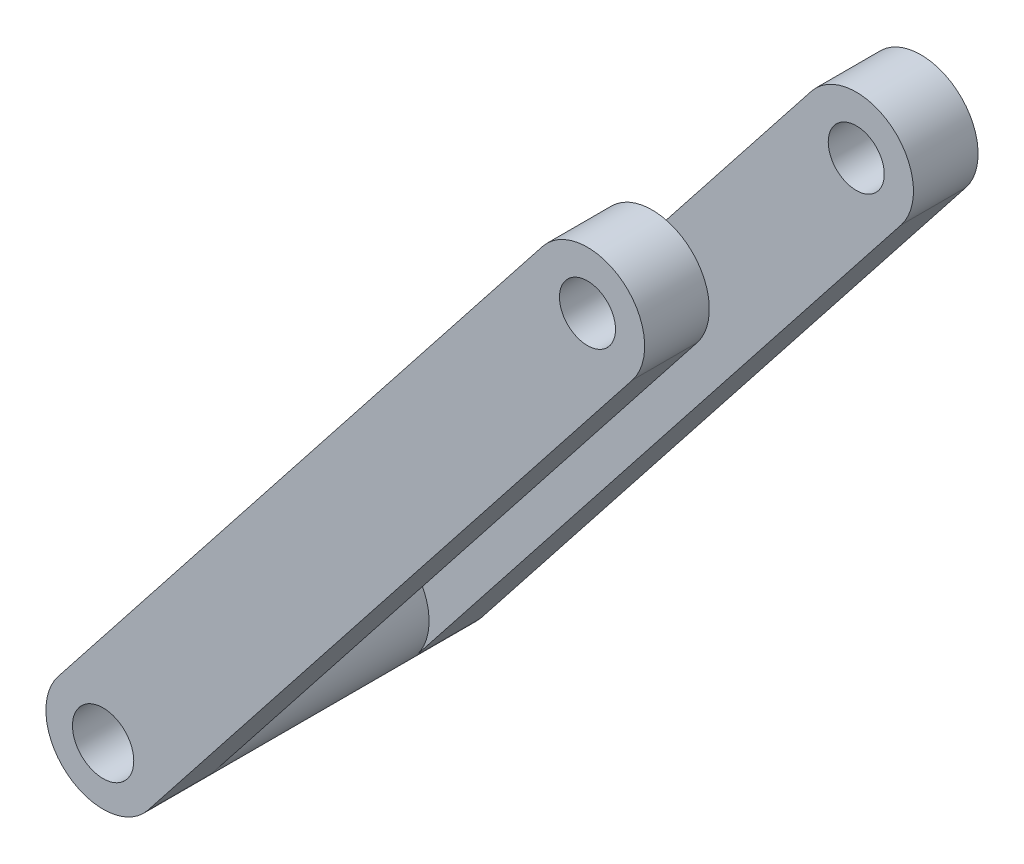
ISO-10303-21;
HEADER;
FILE_DESCRIPTION(('STEP AP214'),'2;1');
FILE_NAME('part.step','',(''),(''),'','','');
FILE_SCHEMA(('AUTOMOTIVE_DESIGN { 1 0 10303 214 1 1 1 1 }'));
ENDSEC;
DATA;
#1=APPLICATION_CONTEXT('core data for automotive mechanical design processes');
#2=APPLICATION_PROTOCOL_DEFINITION('international standard','automotive_design',2000,#1);
#3=PRODUCT_CONTEXT('',#1,'mechanical');
#4=PRODUCT('Part','Part','',(#3));
#5=PRODUCT_RELATED_PRODUCT_CATEGORY('part','',(#4));
#6=PRODUCT_DEFINITION_FORMATION('','',#4);
#7=PRODUCT_DEFINITION_CONTEXT('part definition',#1,'design');
#8=PRODUCT_DEFINITION('design','',#6,#7);
#9=PRODUCT_DEFINITION_SHAPE('','',#8);
#10=(LENGTH_UNIT() NAMED_UNIT(*) SI_UNIT(.MILLI.,.METRE.));
#11=(NAMED_UNIT(*) PLANE_ANGLE_UNIT() SI_UNIT($,.RADIAN.));
#12=(NAMED_UNIT(*) SI_UNIT($,.STERADIAN.) SOLID_ANGLE_UNIT());
#13=UNCERTAINTY_MEASURE_WITH_UNIT(LENGTH_MEASURE(1.E-05),#10,'distance_accuracy_value','');
#14=(GEOMETRIC_REPRESENTATION_CONTEXT(3) GLOBAL_UNCERTAINTY_ASSIGNED_CONTEXT((#13)) GLOBAL_UNIT_ASSIGNED_CONTEXT((#10,
#11,#12)) REPRESENTATION_CONTEXT('',''));
#15=CARTESIAN_POINT('',(0.,0.,0.));
#16=DIRECTION('',(0.,0.,1.));
#17=DIRECTION('',(1.,0.,0.));
#18=AXIS2_PLACEMENT_3D('',#15,#16,#17);
#19=CARTESIAN_POINT('',(40.1999254534189,-31.6838028863277,4.));
#20=DIRECTION('',(-0.785385914455838,0.619006434033094,0.));
#21=DIRECTION('',(-0.619006434033094,-0.785385914455838,0.));
#22=AXIS2_PLACEMENT_3D('',#19,#20,#21);
#23=PLANE('',#22);
#24=DIRECTION('',(0.619006434033094,0.785385914455838,0.));
#25=VECTOR('',#24,1.);
#26=CARTESIAN_POINT('',(40.1999254534189,-31.6838028863277,0.2));
#27=LINE('',#26,#25);
#28=CARTESIAN_POINT('',(57.9908891238605,-9.11089975780648,0.2));
#29=VERTEX_POINT('',#28);
#30=CARTESIAN_POINT('',(86.4651850893828,27.0168523071621,0.2));
#31=VERTEX_POINT('',#30);
#32=EDGE_CURVE('E184',#29,#31,#27,.T.);
#33=ORIENTED_EDGE('',*,*,#32,.T.);
#34=DIRECTION('',(0.,0.,-1.));
#35=VECTOR('',#34,1.);
#36=CARTESIAN_POINT('',(86.4651850893828,27.0168523071621,4.));
#37=LINE('',#36,#35);
#38=CARTESIAN_POINT('',(86.4651850893828,27.0168523071621,4.));
#39=VERTEX_POINT('',#38);
#40=EDGE_CURVE('E42',#39,#31,#37,.T.);
#41=ORIENTED_EDGE('',*,*,#40,.F.);
#42=DIRECTION('',(0.619006434033094,0.785385914455838,0.));
#43=VECTOR('',#42,1.);
#44=CARTESIAN_POINT('',(40.1999254534189,-31.6838028863277,4.));
#45=LINE('',#44,#43);
#46=CARTESIAN_POINT('',(57.9908891238605,-9.11089975780648,4.));
#47=VERTEX_POINT('',#46);
#48=EDGE_CURVE('E170',#47,#39,#45,.T.);
#49=ORIENTED_EDGE('',*,*,#48,.F.);
#50=DIRECTION('',(0.,0.,-1.));
#51=VECTOR('',#50,1.);
#52=CARTESIAN_POINT('',(57.9908891238605,-9.11089975780648,4.));
#53=LINE('',#52,#51);
#54=EDGE_CURVE('E178',#47,#29,#53,.T.);
#55=ORIENTED_EDGE('',*,*,#54,.T.);
#56=EDGE_LOOP('',(#33,#41,#49,#55));
#57=FACE_BOUND('',#56,.T.);
#58=ADVANCED_FACE('F38',(#57),#23,.F.);
#59=CARTESIAN_POINT('',(83.8243347031668,29.0982537561797,4.));
#60=DIRECTION('',(0.,0.,-1.));
#61=DIRECTION('',(-1.,0.,0.));
#62=AXIS2_PLACEMENT_3D('',#59,#60,#61);
#63=CYLINDRICAL_SURFACE('',#62,3.36248758426699);
#64=CARTESIAN_POINT('',(83.8243347031668,29.0982537561797,0.2));
#65=DIRECTION('',(0.,0.,1.));
#66=DIRECTION('',(1.,0.,0.));
#67=AXIS2_PLACEMENT_3D('',#64,#65,#66);
#68=CIRCLE('',#67,3.36248758426699);
#69=CARTESIAN_POINT('',(81.1834843169509,31.1796552051974,0.2));
#70=VERTEX_POINT('',#69);
#71=EDGE_CURVE('E187',#31,#70,#68,.T.);
#72=ORIENTED_EDGE('',*,*,#71,.T.);
#73=DIRECTION('',(0.,0.,-1.));
#74=VECTOR('',#73,1.);
#75=CARTESIAN_POINT('',(81.1834843169509,31.1796552051974,4.));
#76=LINE('',#75,#74);
#77=CARTESIAN_POINT('',(81.1834843169509,31.1796552051974,4.));
#78=VERTEX_POINT('',#77);
#79=EDGE_CURVE('E194',#78,#70,#76,.T.);
#80=ORIENTED_EDGE('',*,*,#79,.F.);
#81=CARTESIAN_POINT('',(83.8243347031668,29.0982537561797,4.));
#82=DIRECTION('',(0.,0.,1.));
#83=DIRECTION('',(1.,0.,0.));
#84=AXIS2_PLACEMENT_3D('',#81,#82,#83);
#85=CIRCLE('',#84,3.36248758426699);
#86=EDGE_CURVE('E88',#39,#78,#85,.T.);
#87=ORIENTED_EDGE('',*,*,#86,.F.);
#88=ORIENTED_EDGE('',*,*,#40,.T.);
#89=EDGE_LOOP('',(#72,#80,#87,#88));
#90=FACE_BOUND('',#89,.T.);
#91=ADVANCED_FACE('F200',(#90),#63,.T.);
#92=CARTESIAN_POINT('',(34.918224680987,-27.5209999882924,4.));
#93=DIRECTION('',(0.785385914455838,-0.619006434033093,0.));
#94=DIRECTION('',(0.619006434033093,0.785385914455839,0.));
#95=AXIS2_PLACEMENT_3D('',#92,#93,#94);
#96=PLANE('',#95);
#97=DIRECTION('',(-0.619006434033093,-0.785385914455839,0.));
#98=VECTOR('',#97,1.);
#99=CARTESIAN_POINT('',(34.918224680987,-27.5209999882924,0.2));
#100=LINE('',#99,#98);
#101=CARTESIAN_POINT('',(52.7091883514286,-4.94809685977118,0.2));
#102=VERTEX_POINT('',#101);
#103=EDGE_CURVE('E189',#70,#102,#100,.T.);
#104=ORIENTED_EDGE('',*,*,#103,.T.);
#105=DIRECTION('',(0.,0.,-1.));
#106=VECTOR('',#105,1.);
#107=CARTESIAN_POINT('',(52.7091883514286,-4.94809685977118,4.));
#108=LINE('',#107,#106);
#109=CARTESIAN_POINT('',(52.7091883547798,-4.94809686241247,4.));
#110=VERTEX_POINT('',#109);
#111=EDGE_CURVE('E193',#110,#102,#108,.T.);
#112=ORIENTED_EDGE('',*,*,#111,.F.);
#113=DIRECTION('',(-0.619006434033093,-0.785385914455839,0.));
#114=VECTOR('',#113,1.);
#115=CARTESIAN_POINT('',(34.918224680987,-27.5209999882924,4.));
#116=LINE('',#115,#114);
#117=EDGE_CURVE('E176',#78,#110,#116,.T.);
#118=ORIENTED_EDGE('',*,*,#117,.F.);
#119=ORIENTED_EDGE('',*,*,#79,.T.);
#120=EDGE_LOOP('',(#104,#112,#118,#119));
#121=FACE_BOUND('',#120,.T.);
#122=ADVANCED_FACE('F206',(#121),#96,.F.);
#123=CARTESIAN_POINT('',(55.3500387376445,-7.02949830878883,4.));
#124=DIRECTION('',(0.,0.,-1.));
#125=DIRECTION('',(-1.,0.,0.));
#126=AXIS2_PLACEMENT_3D('',#123,#124,#125);
#127=CYLINDRICAL_SURFACE('',#126,1.80209428448146);
#128=CARTESIAN_POINT('',(55.3500387376445,-7.02949830878883,4.));
#129=DIRECTION('',(0.,0.,1.));
#130=DIRECTION('',(1.,0.,0.));
#131=AXIS2_PLACEMENT_3D('',#128,#129,#130);
#132=CIRCLE('',#131,1.80209428448146);
#133=CARTESIAN_POINT('',(53.5479444531631,-7.02949830878883,4.));
#134=VERTEX_POINT('',#133);
#135=EDGE_CURVE('E165',#134,#134,#132,.T.);
#136=CARTESIAN_POINT('',(55.3500387376445,-7.02949830878883,0.2));
#137=DIRECTION('',(0.,0.,1.));
#138=DIRECTION('',(1.,0.,0.));
#139=AXIS2_PLACEMENT_3D('',#136,#137,#138);
#140=CIRCLE('',#139,1.80209428448146);
#141=CARTESIAN_POINT('',(53.5479444531631,-7.02949830878883,0.2));
#142=VERTEX_POINT('',#141);
#143=EDGE_CURVE('E181',#142,#142,#140,.T.);
#144=CARTESIAN_POINT('',(53.5479444531631,-7.02949830878883,4.));
#145=CARTESIAN_POINT('',(53.5479444531631,-7.02949830878883,3.96041666666667));
#146=CARTESIAN_POINT('',(53.5479444531631,-7.02949830878883,3.92083333333333));
#147=CARTESIAN_POINT('',(53.5479444531631,-7.02949830878883,3.84166666666667));
#148=CARTESIAN_POINT('',(53.5479444531631,-7.02949830878883,3.80208333333333));
#149=CARTESIAN_POINT('',(53.5479444531631,-7.02949830878883,3.72291666666667));
#150=CARTESIAN_POINT('',(53.5479444531631,-7.02949830878883,3.68333333333333));
#151=CARTESIAN_POINT('',(53.5479444531631,-7.02949830878883,3.60416666666667));
#152=CARTESIAN_POINT('',(53.5479444531631,-7.02949830878883,3.56458333333333));
#153=CARTESIAN_POINT('',(53.5479444531631,-7.02949830878883,3.48541666666667));
#154=CARTESIAN_POINT('',(53.5479444531631,-7.02949830878883,3.44583333333333));
#155=CARTESIAN_POINT('',(53.5479444531631,-7.02949830878883,3.36666666666667));
#156=CARTESIAN_POINT('',(53.5479444531631,-7.02949830878883,3.32708333333333));
#157=CARTESIAN_POINT('',(53.5479444531631,-7.02949830878883,3.24791666666667));
#158=CARTESIAN_POINT('',(53.5479444531631,-7.02949830878883,3.20833333333333));
#159=CARTESIAN_POINT('',(53.5479444531631,-7.02949830878883,3.12916666666667));
#160=CARTESIAN_POINT('',(53.5479444531631,-7.02949830878883,3.08958333333333));
#161=CARTESIAN_POINT('',(53.5479444531631,-7.02949830878883,3.01041666666667));
#162=CARTESIAN_POINT('',(53.5479444531631,-7.02949830878883,2.97083333333333));
#163=CARTESIAN_POINT('',(53.5479444531631,-7.02949830878883,2.89166666666667));
#164=CARTESIAN_POINT('',(53.5479444531631,-7.02949830878883,2.85208333333333));
#165=CARTESIAN_POINT('',(53.5479444531631,-7.02949830878883,2.77291666666667));
#166=CARTESIAN_POINT('',(53.5479444531631,-7.02949830878883,2.73333333333333));
#167=CARTESIAN_POINT('',(53.5479444531631,-7.02949830878883,2.65416666666667));
#168=CARTESIAN_POINT('',(53.5479444531631,-7.02949830878883,2.61458333333333));
#169=CARTESIAN_POINT('',(53.5479444531631,-7.02949830878883,2.53541666666667));
#170=CARTESIAN_POINT('',(53.5479444531631,-7.02949830878883,2.49583333333333));
#171=CARTESIAN_POINT('',(53.5479444531631,-7.02949830878883,2.41666666666667));
#172=CARTESIAN_POINT('',(53.5479444531631,-7.02949830878883,2.37708333333333));
#173=CARTESIAN_POINT('',(53.5479444531631,-7.02949830878883,2.29791666666667));
#174=CARTESIAN_POINT('',(53.5479444531631,-7.02949830878883,2.25833333333333));
#175=CARTESIAN_POINT('',(53.5479444531631,-7.02949830878883,2.17916666666667));
#176=CARTESIAN_POINT('',(53.5479444531631,-7.02949830878883,2.13958333333333));
#177=CARTESIAN_POINT('',(53.5479444531631,-7.02949830878883,2.06041666666667));
#178=CARTESIAN_POINT('',(53.5479444531631,-7.02949830878883,2.02083333333333));
#179=CARTESIAN_POINT('',(53.5479444531631,-7.02949830878883,1.94166666666667));
#180=CARTESIAN_POINT('',(53.5479444531631,-7.02949830878883,1.90208333333333));
#181=CARTESIAN_POINT('',(53.5479444531631,-7.02949830878883,1.82291666666667));
#182=CARTESIAN_POINT('',(53.5479444531631,-7.02949830878883,1.78333333333333));
#183=CARTESIAN_POINT('',(53.5479444531631,-7.02949830878883,1.70416666666667));
#184=CARTESIAN_POINT('',(53.5479444531631,-7.02949830878883,1.66458333333333));
#185=CARTESIAN_POINT('',(53.5479444531631,-7.02949830878883,1.58541666666667));
#186=CARTESIAN_POINT('',(53.5479444531631,-7.02949830878883,1.54583333333333));
#187=CARTESIAN_POINT('',(53.5479444531631,-7.02949830878883,1.46666666666667));
#188=CARTESIAN_POINT('',(53.5479444531631,-7.02949830878883,1.42708333333333));
#189=CARTESIAN_POINT('',(53.5479444531631,-7.02949830878883,1.34791666666667));
#190=CARTESIAN_POINT('',(53.5479444531631,-7.02949830878883,1.30833333333333));
#191=CARTESIAN_POINT('',(53.5479444531631,-7.02949830878883,1.22916666666667));
#192=CARTESIAN_POINT('',(53.5479444531631,-7.02949830878883,1.18958333333333));
#193=CARTESIAN_POINT('',(53.5479444531631,-7.02949830878883,1.11041666666667));
#194=CARTESIAN_POINT('',(53.5479444531631,-7.02949830878883,1.07083333333333));
#195=CARTESIAN_POINT('',(53.5479444531631,-7.02949830878883,0.991666666666667));
#196=CARTESIAN_POINT('',(53.5479444531631,-7.02949830878883,0.952083333333333));
#197=CARTESIAN_POINT('',(53.5479444531631,-7.02949830878883,0.872916666666667));
#198=CARTESIAN_POINT('',(53.5479444531631,-7.02949830878883,0.833333333333333));
#199=CARTESIAN_POINT('',(53.5479444531631,-7.02949830878883,0.754166666666667));
#200=CARTESIAN_POINT('',(53.5479444531631,-7.02949830878883,0.714583333333334));
#201=CARTESIAN_POINT('',(53.5479444531631,-7.02949830878883,0.635416666666667));
#202=CARTESIAN_POINT('',(53.5479444531631,-7.02949830878883,0.595833333333333));
#203=CARTESIAN_POINT('',(53.5479444531631,-7.02949830878883,0.516666666666667));
#204=CARTESIAN_POINT('',(53.5479444531631,-7.02949830878883,0.477083333333333));
#205=CARTESIAN_POINT('',(53.5479444531631,-7.02949830878883,0.397916666666667));
#206=CARTESIAN_POINT('',(53.5479444531631,-7.02949830878883,0.358333333333333));
#207=CARTESIAN_POINT('',(53.5479444531631,-7.02949830878883,0.279166666666667));
#208=CARTESIAN_POINT('',(53.5479444531631,-7.02949830878883,0.239583333333333));
#209=CARTESIAN_POINT('',(53.5479444531631,-7.02949830878883,0.2));
#210=B_SPLINE_CURVE_WITH_KNOTS('',3,(#144,#145,#146,#147,#148,#149,#150,#151,#152,#153,#154,
#155,#156,#157,#158,#159,#160,#161,#162,#163,#164,#165,#166,#167,#168,#169,#170,#171,#172,#173,
#174,#175,#176,#177,#178,#179,#180,#181,#182,#183,#184,#185,#186,#187,#188,#189,#190,#191,#192,
#193,#194,#195,#196,#197,#198,#199,#200,#201,#202,#203,#204,#205,#206,#207,#208,#209),
.UNSPECIFIED.,.F.,.F.,(4,2,2,2,2,2,2,2,2,2,2,2,2,2,2,2,2,2,2,2,2,2,2,2,2,2,2,2,2,2,2,2,4),(0.,
0.11875,0.2375,0.35625,0.475000000000001,0.593750000000001,0.7125,0.83125,0.95,1.06875,1.1875,
1.30625,1.425,1.54375,1.6625,1.78125,1.9,2.01875,2.1375,2.25625,2.375,2.49375,2.6125,2.73125,
2.85,2.96875,3.0875,3.20625,3.325,3.44375,3.5625,3.68125,3.8),.UNSPECIFIED.);
#211=EDGE_CURVE('BSEAM215',#134,#142,#210,.T.);
#212=ORIENTED_EDGE('',*,*,#135,.T.);
#213=ORIENTED_EDGE('',*,*,#143,.F.);
#214=ORIENTED_EDGE('',*,*,#211,.T.);
#215=ORIENTED_EDGE('',*,*,#211,.F.);
#216=EDGE_LOOP('',(#212,#214,#213,#215));
#217=FACE_BOUND('',#216,.T.);
#218=ADVANCED_FACE('F215',(#217),#127,.F.);
#219=CARTESIAN_POINT('',(83.8243347031668,29.0982537561797,4.));
#220=DIRECTION('',(0.,0.,-1.));
#221=DIRECTION('',(-1.,0.,0.));
#222=AXIS2_PLACEMENT_3D('',#219,#220,#221);
#223=CYLINDRICAL_SURFACE('',#222,1.64762906009732);
#224=CARTESIAN_POINT('',(83.8243347031668,29.0982537561797,4.));
#225=DIRECTION('',(0.,0.,1.));
#226=DIRECTION('',(1.,0.,0.));
#227=AXIS2_PLACEMENT_3D('',#224,#225,#226);
#228=CIRCLE('',#227,1.64762906009732);
#229=CARTESIAN_POINT('',(82.1767056430695,29.0982537561797,4.));
#230=VERTEX_POINT('',#229);
#231=EDGE_CURVE('E167',#230,#230,#228,.T.);
#232=CARTESIAN_POINT('',(83.8243347031668,29.0982537561797,0.2));
#233=DIRECTION('',(0.,0.,1.));
#234=DIRECTION('',(1.,0.,0.));
#235=AXIS2_PLACEMENT_3D('',#232,#233,#234);
#236=CIRCLE('',#235,1.64762906009732);
#237=CARTESIAN_POINT('',(82.1767056430695,29.0982537561797,0.2));
#238=VERTEX_POINT('',#237);
#239=EDGE_CURVE('E173',#238,#238,#236,.T.);
#240=CARTESIAN_POINT('',(82.1767056430695,29.0982537561797,4.));
#241=CARTESIAN_POINT('',(82.1767056430695,29.0982537561797,3.96041666666667));
#242=CARTESIAN_POINT('',(82.1767056430695,29.0982537561797,3.92083333333333));
#243=CARTESIAN_POINT('',(82.1767056430695,29.0982537561797,3.84166666666667));
#244=CARTESIAN_POINT('',(82.1767056430695,29.0982537561797,3.80208333333333));
#245=CARTESIAN_POINT('',(82.1767056430695,29.0982537561797,3.72291666666667));
#246=CARTESIAN_POINT('',(82.1767056430695,29.0982537561797,3.68333333333333));
#247=CARTESIAN_POINT('',(82.1767056430695,29.0982537561797,3.60416666666667));
#248=CARTESIAN_POINT('',(82.1767056430695,29.0982537561797,3.56458333333333));
#249=CARTESIAN_POINT('',(82.1767056430695,29.0982537561797,3.48541666666667));
#250=CARTESIAN_POINT('',(82.1767056430695,29.0982537561797,3.44583333333333));
#251=CARTESIAN_POINT('',(82.1767056430695,29.0982537561797,3.36666666666667));
#252=CARTESIAN_POINT('',(82.1767056430695,29.0982537561797,3.32708333333333));
#253=CARTESIAN_POINT('',(82.1767056430695,29.0982537561797,3.24791666666667));
#254=CARTESIAN_POINT('',(82.1767056430695,29.0982537561797,3.20833333333333));
#255=CARTESIAN_POINT('',(82.1767056430695,29.0982537561797,3.12916666666667));
#256=CARTESIAN_POINT('',(82.1767056430695,29.0982537561797,3.08958333333333));
#257=CARTESIAN_POINT('',(82.1767056430695,29.0982537561797,3.01041666666667));
#258=CARTESIAN_POINT('',(82.1767056430695,29.0982537561797,2.97083333333333));
#259=CARTESIAN_POINT('',(82.1767056430695,29.0982537561797,2.89166666666667));
#260=CARTESIAN_POINT('',(82.1767056430695,29.0982537561797,2.85208333333333));
#261=CARTESIAN_POINT('',(82.1767056430695,29.0982537561797,2.77291666666667));
#262=CARTESIAN_POINT('',(82.1767056430695,29.0982537561797,2.73333333333333));
#263=CARTESIAN_POINT('',(82.1767056430695,29.0982537561797,2.65416666666667));
#264=CARTESIAN_POINT('',(82.1767056430695,29.0982537561797,2.61458333333333));
#265=CARTESIAN_POINT('',(82.1767056430695,29.0982537561797,2.53541666666667));
#266=CARTESIAN_POINT('',(82.1767056430695,29.0982537561797,2.49583333333333));
#267=CARTESIAN_POINT('',(82.1767056430695,29.0982537561797,2.41666666666667));
#268=CARTESIAN_POINT('',(82.1767056430695,29.0982537561797,2.37708333333333));
#269=CARTESIAN_POINT('',(82.1767056430695,29.0982537561797,2.29791666666667));
#270=CARTESIAN_POINT('',(82.1767056430695,29.0982537561797,2.25833333333333));
#271=CARTESIAN_POINT('',(82.1767056430695,29.0982537561797,2.17916666666667));
#272=CARTESIAN_POINT('',(82.1767056430695,29.0982537561797,2.13958333333333));
#273=CARTESIAN_POINT('',(82.1767056430695,29.0982537561797,2.06041666666667));
#274=CARTESIAN_POINT('',(82.1767056430695,29.0982537561797,2.02083333333333));
#275=CARTESIAN_POINT('',(82.1767056430695,29.0982537561797,1.94166666666667));
#276=CARTESIAN_POINT('',(82.1767056430695,29.0982537561797,1.90208333333333));
#277=CARTESIAN_POINT('',(82.1767056430695,29.0982537561797,1.82291666666667));
#278=CARTESIAN_POINT('',(82.1767056430695,29.0982537561797,1.78333333333333));
#279=CARTESIAN_POINT('',(82.1767056430695,29.0982537561797,1.70416666666667));
#280=CARTESIAN_POINT('',(82.1767056430695,29.0982537561797,1.66458333333333));
#281=CARTESIAN_POINT('',(82.1767056430695,29.0982537561797,1.58541666666667));
#282=CARTESIAN_POINT('',(82.1767056430695,29.0982537561797,1.54583333333333));
#283=CARTESIAN_POINT('',(82.1767056430695,29.0982537561797,1.46666666666667));
#284=CARTESIAN_POINT('',(82.1767056430695,29.0982537561797,1.42708333333333));
#285=CARTESIAN_POINT('',(82.1767056430695,29.0982537561797,1.34791666666667));
#286=CARTESIAN_POINT('',(82.1767056430695,29.0982537561797,1.30833333333333));
#287=CARTESIAN_POINT('',(82.1767056430695,29.0982537561797,1.22916666666667));
#288=CARTESIAN_POINT('',(82.1767056430695,29.0982537561797,1.18958333333333));
#289=CARTESIAN_POINT('',(82.1767056430695,29.0982537561797,1.11041666666667));
#290=CARTESIAN_POINT('',(82.1767056430695,29.0982537561797,1.07083333333333));
#291=CARTESIAN_POINT('',(82.1767056430695,29.0982537561797,0.991666666666667));
#292=CARTESIAN_POINT('',(82.1767056430695,29.0982537561797,0.952083333333333));
#293=CARTESIAN_POINT('',(82.1767056430695,29.0982537561797,0.872916666666667));
#294=CARTESIAN_POINT('',(82.1767056430695,29.0982537561797,0.833333333333333));
#295=CARTESIAN_POINT('',(82.1767056430695,29.0982537561797,0.754166666666667));
#296=CARTESIAN_POINT('',(82.1767056430695,29.0982537561797,0.714583333333334));
#297=CARTESIAN_POINT('',(82.1767056430695,29.0982537561797,0.635416666666667));
#298=CARTESIAN_POINT('',(82.1767056430695,29.0982537561797,0.595833333333333));
#299=CARTESIAN_POINT('',(82.1767056430695,29.0982537561797,0.516666666666667));
#300=CARTESIAN_POINT('',(82.1767056430695,29.0982537561797,0.477083333333333));
#301=CARTESIAN_POINT('',(82.1767056430695,29.0982537561797,0.397916666666667));
#302=CARTESIAN_POINT('',(82.1767056430695,29.0982537561797,0.358333333333333));
#303=CARTESIAN_POINT('',(82.1767056430695,29.0982537561797,0.279166666666667));
#304=CARTESIAN_POINT('',(82.1767056430695,29.0982537561797,0.239583333333333));
#305=CARTESIAN_POINT('',(82.1767056430695,29.0982537561797,0.2));
#306=B_SPLINE_CURVE_WITH_KNOTS('',3,(#240,#241,#242,#243,#244,#245,#246,#247,#248,#249,#250,
#251,#252,#253,#254,#255,#256,#257,#258,#259,#260,#261,#262,#263,#264,#265,#266,#267,#268,#269,
#270,#271,#272,#273,#274,#275,#276,#277,#278,#279,#280,#281,#282,#283,#284,#285,#286,#287,#288,
#289,#290,#291,#292,#293,#294,#295,#296,#297,#298,#299,#300,#301,#302,#303,#304,#305),
.UNSPECIFIED.,.F.,.F.,(4,2,2,2,2,2,2,2,2,2,2,2,2,2,2,2,2,2,2,2,2,2,2,2,2,2,2,2,2,2,2,2,4),(0.,
0.11875,0.2375,0.35625,0.475000000000001,0.593750000000001,0.7125,0.83125,0.95,1.06875,1.1875,
1.30625,1.425,1.54375,1.6625,1.78125,1.9,2.01875,2.1375,2.25625,2.375,2.49375,2.6125,2.73125,
2.85,2.96875,3.0875,3.20625,3.325,3.44375,3.5625,3.68125,3.8),.UNSPECIFIED.);
#307=EDGE_CURVE('BSEAM40',#230,#238,#306,.T.);
#308=ORIENTED_EDGE('',*,*,#231,.T.);
#309=ORIENTED_EDGE('',*,*,#239,.F.);
#310=ORIENTED_EDGE('',*,*,#307,.T.);
#311=ORIENTED_EDGE('',*,*,#307,.F.);
#312=EDGE_LOOP('',(#308,#310,#309,#311));
#313=FACE_BOUND('',#312,.T.);
#314=ADVANCED_FACE('F40',(#313),#223,.F.);
#315=CARTESIAN_POINT('',(55.3500387376445,-7.02949830878883,4.));
#316=DIRECTION('',(0.,0.,-1.));
#317=DIRECTION('',(-1.,0.,0.));
#318=AXIS2_PLACEMENT_3D('',#315,#316,#317);
#319=CYLINDRICAL_SURFACE('',#318,3.36248758426698);
#320=CARTESIAN_POINT('',(55.3500387376445,-7.02949830878883,15.9999999999998));
#321=DIRECTION('',(0.,0.,1.));
#322=DIRECTION('',(1.,0.,0.));
#323=AXIS2_PLACEMENT_3D('',#320,#321,#322);
#324=CIRCLE('',#323,3.36248758);
#325=CARTESIAN_POINT('',(57.9908891238605,-9.11089975780649,15.9999999999998));
#326=VERTEX_POINT('',#325);
#327=CARTESIAN_POINT('',(52.7091883514286,-4.94809685977118,15.9999999999998));
#328=VERTEX_POINT('',#327);
#329=EDGE_CURVE('E54',#326,#328,#324,.T.);
#330=ORIENTED_EDGE('',*,*,#329,.F.);
#331=DIRECTION('',(0.,0.,1.));
#332=VECTOR('',#331,1.);
#333=CARTESIAN_POINT('',(57.9908891238605,-9.11089975780648,15.9999999999998));
#334=LINE('',#333,#332);
#335=CARTESIAN_POINT('',(57.9908891238605,-9.11089975780648,19.7999999999998));
#336=VERTEX_POINT('',#335);
#337=EDGE_CURVE('E131',#326,#336,#334,.T.);
#338=ORIENTED_EDGE('',*,*,#337,.T.);
#339=CARTESIAN_POINT('',(55.3500387376445,-7.02949830878883,19.7999999999998));
#340=DIRECTION('',(0.,0.,1.));
#341=DIRECTION('',(1.,0.,0.));
#342=AXIS2_PLACEMENT_3D('',#339,#340,#341);
#343=CIRCLE('',#342,3.36248758426698);
#344=CARTESIAN_POINT('',(52.7091883514286,-4.94809685977118,19.7999999999998));
#345=VERTEX_POINT('',#344);
#346=EDGE_CURVE('E127',#345,#336,#343,.T.);
#347=ORIENTED_EDGE('',*,*,#346,.F.);
#348=DIRECTION('',(0.,0.,1.));
#349=VECTOR('',#348,1.);
#350=CARTESIAN_POINT('',(52.7091883514286,-4.94809685977118,15.9999999999998));
#351=LINE('',#350,#349);
#352=EDGE_CURVE('E124',#328,#345,#351,.T.);
#353=ORIENTED_EDGE('',*,*,#352,.F.);
#354=EDGE_LOOP('',(#330,#338,#347,#353));
#355=FACE_BOUND('',#354,.T.);
#356=CARTESIAN_POINT('',(55.3500387376445,-7.02949830878883,4.));
#357=DIRECTION('',(0.,0.,1.));
#358=DIRECTION('',(1.,0.,0.));
#359=AXIS2_PLACEMENT_3D('',#356,#357,#358);
#360=CIRCLE('',#359,3.36248758);
#361=EDGE_CURVE('E11',#47,#110,#360,.T.);
#362=ORIENTED_EDGE('',*,*,#361,.T.);
#363=ORIENTED_EDGE('',*,*,#111,.T.);
#364=CARTESIAN_POINT('',(55.3500387376445,-7.02949830878883,0.2));
#365=DIRECTION('',(0.,0.,1.));
#366=DIRECTION('',(1.,0.,0.));
#367=AXIS2_PLACEMENT_3D('',#364,#365,#366);
#368=CIRCLE('',#367,3.36248758426698);
#369=EDGE_CURVE('E82',#102,#29,#368,.T.);
#370=ORIENTED_EDGE('',*,*,#369,.T.);
#371=ORIENTED_EDGE('',*,*,#54,.F.);
#372=EDGE_LOOP('',(#362,#363,#370,#371));
#373=FACE_BOUND('',#372,.T.);
#374=ADVANCED_FACE('F125',(#355,#373),#319,.T.);
#375=CARTESIAN_POINT('',(0.,0.,4.));
#376=DIRECTION('',(0.,0.,1.));
#377=DIRECTION('',(1.,0.,0.));
#378=AXIS2_PLACEMENT_3D('',#375,#376,#377);
#379=PLANE('',#378);
#380=ORIENTED_EDGE('',*,*,#361,.F.);
#381=ORIENTED_EDGE('',*,*,#48,.T.);
#382=ORIENTED_EDGE('',*,*,#86,.T.);
#383=ORIENTED_EDGE('',*,*,#117,.T.);
#384=EDGE_LOOP('',(#380,#381,#382,#383));
#385=FACE_BOUND('',#384,.T.);
#386=ORIENTED_EDGE('',*,*,#231,.F.);
#387=EDGE_LOOP('',(#386));
#388=FACE_BOUND('',#387,.T.);
#389=ADVANCED_FACE('F207',(#385,#388),#379,.T.);
#390=CARTESIAN_POINT('',(0.,0.,0.2));
#391=DIRECTION('',(0.,0.,1.));
#392=DIRECTION('',(1.,0.,0.));
#393=AXIS2_PLACEMENT_3D('',#390,#391,#392);
#394=PLANE('',#393);
#395=ORIENTED_EDGE('',*,*,#239,.T.);
#396=EDGE_LOOP('',(#395));
#397=FACE_BOUND('',#396,.T.);
#398=ORIENTED_EDGE('',*,*,#143,.T.);
#399=EDGE_LOOP('',(#398));
#400=FACE_BOUND('',#399,.T.);
#401=ORIENTED_EDGE('',*,*,#32,.F.);
#402=ORIENTED_EDGE('',*,*,#369,.F.);
#403=ORIENTED_EDGE('',*,*,#103,.F.);
#404=ORIENTED_EDGE('',*,*,#71,.F.);
#405=EDGE_LOOP('',(#401,#402,#403,#404));
#406=FACE_BOUND('',#405,.T.);
#407=ADVANCED_FACE('F205',(#397,#400,#406),#394,.F.);
#408=CARTESIAN_POINT('',(55.3500387376445,-7.02949830878883,4.));
#409=DIRECTION('',(0.,0.,1.));
#410=DIRECTION('',(1.,0.,0.));
#411=AXIS2_PLACEMENT_3D('',#408,#409,#410);
#412=PLANE('',#411);
#413=ORIENTED_EDGE('',*,*,#135,.F.);
#414=EDGE_LOOP('',(#413));
#415=FACE_BOUND('',#414,.T.);
#416=CARTESIAN_POINT('',(55.3500387376445,-7.02949830878883,4.));
#417=DIRECTION('',(0.,0.,1.));
#418=DIRECTION('',(1.,0.,0.));
#419=AXIS2_PLACEMENT_3D('',#416,#417,#418);
#420=CIRCLE('',#419,1.8);
#421=CARTESIAN_POINT('',(57.1500387376445,-7.02949830878883,4.));
#422=VERTEX_POINT('',#421);
#423=EDGE_CURVE('E120',#422,#422,#420,.T.);
#424=ORIENTED_EDGE('',*,*,#423,.T.);
#425=EDGE_LOOP('',(#424));
#426=FACE_BOUND('',#425,.T.);
#427=ADVANCED_FACE('F220',(#415,#426),#412,.F.);
#428=CARTESIAN_POINT('',(55.3500387376445,-7.02949830878883,19.5105510778941));
#429=DIRECTION('',(0.,0.,-1.));
#430=DIRECTION('',(-1.,0.,0.));
#431=AXIS2_PLACEMENT_3D('',#428,#429,#430);
#432=CYLINDRICAL_SURFACE('',#431,1.8);
#433=CARTESIAN_POINT('',(55.3500387376445,-7.02949830878883,15.9999999999998));
#434=DIRECTION('',(0.,0.,1.));
#435=DIRECTION('',(1.,0.,0.));
#436=AXIS2_PLACEMENT_3D('',#433,#434,#435);
#437=CIRCLE('',#436,1.8);
#438=CARTESIAN_POINT('',(57.1500387376445,-7.02949830878883,15.9999999999998));
#439=VERTEX_POINT('',#438);
#440=EDGE_CURVE('E121',#439,#439,#437,.T.);
#441=ORIENTED_EDGE('',*,*,#440,.T.);
#442=EDGE_LOOP('',(#441));
#443=FACE_BOUND('',#442,.T.);
#444=ORIENTED_EDGE('',*,*,#423,.F.);
#445=EDGE_LOOP('',(#444));
#446=FACE_BOUND('',#445,.T.);
#447=ADVANCED_FACE('F241',(#443,#446),#432,.F.);
#448=CARTESIAN_POINT('',(55.3500387376445,-7.02949830878883,15.9999999999998));
#449=DIRECTION('',(0.,0.,-1.));
#450=DIRECTION('',(1.,0.,0.));
#451=AXIS2_PLACEMENT_3D('',#448,#449,#450);
#452=PLANE('',#451);
#453=CARTESIAN_POINT('',(55.3500387376445,-7.02949830878883,15.9999999999998));
#454=DIRECTION('',(0.,0.,1.));
#455=DIRECTION('',(1.,0.,0.));
#456=AXIS2_PLACEMENT_3D('',#453,#454,#455);
#457=CIRCLE('',#456,1.80209428448146);
#458=CARTESIAN_POINT('',(57.152133022126,-7.02949830878883,15.9999999999998));
#459=VERTEX_POINT('',#458);
#460=EDGE_CURVE('E139',#459,#459,#457,.T.);
#461=ORIENTED_EDGE('',*,*,#460,.T.);
#462=EDGE_LOOP('',(#461));
#463=FACE_BOUND('',#462,.T.);
#464=ORIENTED_EDGE('',*,*,#440,.F.);
#465=EDGE_LOOP('',(#464));
#466=FACE_BOUND('',#465,.T.);
#467=ADVANCED_FACE('F245',(#463,#466),#452,.F.);
#468=CARTESIAN_POINT('',(40.1999254534189,-31.6838028863277,15.9999999999998));
#469=DIRECTION('',(0.785385914455838,-0.619006434033094,0.));
#470=DIRECTION('',(0.619006434033094,0.785385914455838,0.));
#471=AXIS2_PLACEMENT_3D('',#468,#469,#470);
#472=PLANE('',#471);
#473=DIRECTION('',(0.619006434033094,0.785385914455838,0.));
#474=VECTOR('',#473,1.);
#475=CARTESIAN_POINT('',(40.1999254534189,-31.6838028863277,19.7999999999998));
#476=LINE('',#475,#474);
#477=CARTESIAN_POINT('',(86.4651850893828,27.0168523071621,19.7999999999998));
#478=VERTEX_POINT('',#477);
#479=EDGE_CURVE('E149',#336,#478,#476,.T.);
#480=ORIENTED_EDGE('',*,*,#479,.F.);
#481=ORIENTED_EDGE('',*,*,#337,.F.);
#482=DIRECTION('',(0.619006434033094,0.785385914455838,0.));
#483=VECTOR('',#482,1.);
#484=CARTESIAN_POINT('',(40.1999254534189,-31.6838028863277,15.9999999999998));
#485=LINE('',#484,#483);
#486=CARTESIAN_POINT('',(86.4651850893828,27.0168523071621,15.9999999999998));
#487=VERTEX_POINT('',#486);
#488=EDGE_CURVE('E119',#326,#487,#485,.T.);
#489=ORIENTED_EDGE('',*,*,#488,.T.);
#490=DIRECTION('',(0.,0.,1.));
#491=VECTOR('',#490,1.);
#492=CARTESIAN_POINT('',(86.4651850893828,27.0168523071621,15.9999999999998));
#493=LINE('',#492,#491);
#494=EDGE_CURVE('E137',#487,#478,#493,.T.);
#495=ORIENTED_EDGE('',*,*,#494,.T.);
#496=EDGE_LOOP('',(#480,#481,#489,#495));
#497=FACE_BOUND('',#496,.T.);
#498=ADVANCED_FACE('F249',(#497),#472,.T.);
#499=CARTESIAN_POINT('',(34.918224680987,-27.5209999882924,15.9999999999998));
#500=DIRECTION('',(-0.785385914455838,0.619006434033093,0.));
#501=DIRECTION('',(-0.619006434033093,-0.785385914455839,0.));
#502=AXIS2_PLACEMENT_3D('',#499,#500,#501);
#503=PLANE('',#502);
#504=DIRECTION('',(-0.619006434033093,-0.785385914455839,0.));
#505=VECTOR('',#504,1.);
#506=CARTESIAN_POINT('',(34.918224680987,-27.5209999882924,19.7999999999998));
#507=LINE('',#506,#505);
#508=CARTESIAN_POINT('',(81.1834843169509,31.1796552051974,19.7999999999998));
#509=VERTEX_POINT('',#508);
#510=EDGE_CURVE('E153',#509,#345,#507,.T.);
#511=ORIENTED_EDGE('',*,*,#510,.F.);
#512=DIRECTION('',(0.,0.,1.));
#513=VECTOR('',#512,1.);
#514=CARTESIAN_POINT('',(81.1834843169509,31.1796552051974,15.9999999999998));
#515=LINE('',#514,#513);
#516=CARTESIAN_POINT('',(81.1834843169509,31.1796552051974,15.9999999999998));
#517=VERTEX_POINT('',#516);
#518=EDGE_CURVE('E132',#517,#509,#515,.T.);
#519=ORIENTED_EDGE('',*,*,#518,.F.);
#520=DIRECTION('',(-0.619006434033093,-0.785385914455839,0.));
#521=VECTOR('',#520,1.);
#522=CARTESIAN_POINT('',(34.918224680987,-27.5209999882924,15.9999999999998));
#523=LINE('',#522,#521);
#524=EDGE_CURVE('E116',#517,#328,#523,.T.);
#525=ORIENTED_EDGE('',*,*,#524,.T.);
#526=ORIENTED_EDGE('',*,*,#352,.T.);
#527=EDGE_LOOP('',(#511,#519,#525,#526));
#528=FACE_BOUND('',#527,.T.);
#529=ADVANCED_FACE('F134',(#528),#503,.T.);
#530=CARTESIAN_POINT('',(55.3500387376445,-7.02949830878883,15.9999999999998));
#531=DIRECTION('',(0.,0.,1.));
#532=DIRECTION('',(1.,0.,0.));
#533=AXIS2_PLACEMENT_3D('',#530,#531,#532);
#534=CYLINDRICAL_SURFACE('',#533,1.80209428448146);
#535=CARTESIAN_POINT('',(55.3500387376445,-7.02949830878883,19.7999999999998));
#536=DIRECTION('',(0.,0.,1.));
#537=DIRECTION('',(1.,0.,0.));
#538=AXIS2_PLACEMENT_3D('',#535,#536,#537);
#539=CIRCLE('',#538,1.80209428448146);
#540=CARTESIAN_POINT('',(57.152133022126,-7.02949830878883,19.7999999999998));
#541=VERTEX_POINT('',#540);
#542=EDGE_CURVE('E146',#541,#541,#539,.T.);
#543=CARTESIAN_POINT('',(57.152133022126,-7.02949830878883,15.9999999999998));
#544=CARTESIAN_POINT('',(57.152133022126,-7.02949830878883,16.0395833333331));
#545=CARTESIAN_POINT('',(57.152133022126,-7.02949830878883,16.0791666666665));
#546=CARTESIAN_POINT('',(57.152133022126,-7.02949830878883,16.1583333333331));
#547=CARTESIAN_POINT('',(57.152133022126,-7.02949830878883,16.1979166666665));
#548=CARTESIAN_POINT('',(57.152133022126,-7.02949830878883,16.2770833333331));
#549=CARTESIAN_POINT('',(57.152133022126,-7.02949830878883,16.3166666666665));
#550=CARTESIAN_POINT('',(57.152133022126,-7.02949830878883,16.3958333333331));
#551=CARTESIAN_POINT('',(57.152133022126,-7.02949830878883,16.4354166666665));
#552=CARTESIAN_POINT('',(57.152133022126,-7.02949830878883,16.5145833333331));
#553=CARTESIAN_POINT('',(57.152133022126,-7.02949830878883,16.5541666666665));
#554=CARTESIAN_POINT('',(57.152133022126,-7.02949830878883,16.6333333333331));
#555=CARTESIAN_POINT('',(57.152133022126,-7.02949830878883,16.6729166666665));
#556=CARTESIAN_POINT('',(57.152133022126,-7.02949830878883,16.7520833333331));
#557=CARTESIAN_POINT('',(57.152133022126,-7.02949830878883,16.7916666666665));
#558=CARTESIAN_POINT('',(57.152133022126,-7.02949830878883,16.8708333333331));
#559=CARTESIAN_POINT('',(57.152133022126,-7.02949830878883,16.9104166666665));
#560=CARTESIAN_POINT('',(57.152133022126,-7.02949830878883,16.9895833333331));
#561=CARTESIAN_POINT('',(57.152133022126,-7.02949830878883,17.0291666666665));
#562=CARTESIAN_POINT('',(57.152133022126,-7.02949830878883,17.1083333333331));
#563=CARTESIAN_POINT('',(57.152133022126,-7.02949830878883,17.1479166666665));
#564=CARTESIAN_POINT('',(57.152133022126,-7.02949830878883,17.2270833333331));
#565=CARTESIAN_POINT('',(57.152133022126,-7.02949830878883,17.2666666666665));
#566=CARTESIAN_POINT('',(57.152133022126,-7.02949830878883,17.3458333333331));
#567=CARTESIAN_POINT('',(57.152133022126,-7.02949830878883,17.3854166666665));
#568=CARTESIAN_POINT('',(57.152133022126,-7.02949830878883,17.4645833333331));
#569=CARTESIAN_POINT('',(57.152133022126,-7.02949830878883,17.5041666666665));
#570=CARTESIAN_POINT('',(57.152133022126,-7.02949830878883,17.5833333333331));
#571=CARTESIAN_POINT('',(57.152133022126,-7.02949830878883,17.6229166666665));
#572=CARTESIAN_POINT('',(57.152133022126,-7.02949830878883,17.7020833333331));
#573=CARTESIAN_POINT('',(57.152133022126,-7.02949830878883,17.7416666666665));
#574=CARTESIAN_POINT('',(57.152133022126,-7.02949830878883,17.8208333333331));
#575=CARTESIAN_POINT('',(57.152133022126,-7.02949830878883,17.8604166666665));
#576=CARTESIAN_POINT('',(57.152133022126,-7.02949830878883,17.9395833333331));
#577=CARTESIAN_POINT('',(57.152133022126,-7.02949830878883,17.9791666666665));
#578=CARTESIAN_POINT('',(57.152133022126,-7.02949830878883,18.0583333333331));
#579=CARTESIAN_POINT('',(57.152133022126,-7.02949830878883,18.0979166666665));
#580=CARTESIAN_POINT('',(57.152133022126,-7.02949830878883,18.1770833333331));
#581=CARTESIAN_POINT('',(57.152133022126,-7.02949830878883,18.2166666666665));
#582=CARTESIAN_POINT('',(57.152133022126,-7.02949830878883,18.2958333333331));
#583=CARTESIAN_POINT('',(57.152133022126,-7.02949830878883,18.3354166666665));
#584=CARTESIAN_POINT('',(57.152133022126,-7.02949830878883,18.4145833333331));
#585=CARTESIAN_POINT('',(57.152133022126,-7.02949830878883,18.4541666666665));
#586=CARTESIAN_POINT('',(57.152133022126,-7.02949830878883,18.5333333333331));
#587=CARTESIAN_POINT('',(57.152133022126,-7.02949830878883,18.5729166666665));
#588=CARTESIAN_POINT('',(57.152133022126,-7.02949830878883,18.6520833333331));
#589=CARTESIAN_POINT('',(57.152133022126,-7.02949830878883,18.6916666666665));
#590=CARTESIAN_POINT('',(57.152133022126,-7.02949830878883,18.7708333333331));
#591=CARTESIAN_POINT('',(57.152133022126,-7.02949830878883,18.8104166666665));
#592=CARTESIAN_POINT('',(57.152133022126,-7.02949830878883,18.8895833333331));
#593=CARTESIAN_POINT('',(57.152133022126,-7.02949830878883,18.9291666666665));
#594=CARTESIAN_POINT('',(57.152133022126,-7.02949830878883,19.0083333333331));
#595=CARTESIAN_POINT('',(57.152133022126,-7.02949830878883,19.0479166666665));
#596=CARTESIAN_POINT('',(57.152133022126,-7.02949830878883,19.1270833333331));
#597=CARTESIAN_POINT('',(57.152133022126,-7.02949830878883,19.1666666666665));
#598=CARTESIAN_POINT('',(57.152133022126,-7.02949830878883,19.2458333333331));
#599=CARTESIAN_POINT('',(57.152133022126,-7.02949830878883,19.2854166666665));
#600=CARTESIAN_POINT('',(57.152133022126,-7.02949830878883,19.3645833333331));
#601=CARTESIAN_POINT('',(57.152133022126,-7.02949830878883,19.4041666666665));
#602=CARTESIAN_POINT('',(57.152133022126,-7.02949830878883,19.4833333333331));
#603=CARTESIAN_POINT('',(57.152133022126,-7.02949830878883,19.5229166666665));
#604=CARTESIAN_POINT('',(57.152133022126,-7.02949830878883,19.6020833333331));
#605=CARTESIAN_POINT('',(57.152133022126,-7.02949830878883,19.6416666666665));
#606=CARTESIAN_POINT('',(57.152133022126,-7.02949830878883,19.7208333333331));
#607=CARTESIAN_POINT('',(57.152133022126,-7.02949830878883,19.7604166666665));
#608=CARTESIAN_POINT('',(57.152133022126,-7.02949830878883,19.7999999999998));
#609=B_SPLINE_CURVE_WITH_KNOTS('',3,(#543,#544,#545,#546,#547,#548,#549,#550,#551,#552,#553,
#554,#555,#556,#557,#558,#559,#560,#561,#562,#563,#564,#565,#566,#567,#568,#569,#570,#571,#572,
#573,#574,#575,#576,#577,#578,#579,#580,#581,#582,#583,#584,#585,#586,#587,#588,#589,#590,#591,
#592,#593,#594,#595,#596,#597,#598,#599,#600,#601,#602,#603,#604,#605,#606,#607,#608),
.UNSPECIFIED.,.F.,.F.,(4,2,2,2,2,2,2,2,2,2,2,2,2,2,2,2,2,2,2,2,2,2,2,2,2,2,2,2,2,2,2,2,4),(0.,
0.118749999999997,0.237499999999998,0.356249999999999,0.475,0.593749999999997,0.712499999999998,
0.831249999999999,0.95,1.06875,1.1875,1.30625,1.425,1.54375,1.6625,1.78125,1.9,2.01875,2.1375,
2.25625,2.375,2.49375,2.6125,2.73125,2.85,2.96875,3.0875,3.20625,3.325,3.44375,3.5625,3.68125,
3.8),.UNSPECIFIED.);
#610=EDGE_CURVE('BSEAM255',#459,#541,#609,.T.);
#611=ORIENTED_EDGE('',*,*,#460,.F.);
#612=ORIENTED_EDGE('',*,*,#542,.T.);
#613=ORIENTED_EDGE('',*,*,#610,.T.);
#614=ORIENTED_EDGE('',*,*,#610,.F.);
#615=EDGE_LOOP('',(#611,#613,#612,#614));
#616=FACE_BOUND('',#615,.T.);
#617=ADVANCED_FACE('F255',(#616),#534,.F.);
#618=CARTESIAN_POINT('',(83.8243347031668,29.0982537561797,15.9999999999998));
#619=DIRECTION('',(0.,0.,1.));
#620=DIRECTION('',(1.,0.,0.));
#621=AXIS2_PLACEMENT_3D('',#618,#619,#620);
#622=CYLINDRICAL_SURFACE('',#621,1.64762906009732);
#623=CARTESIAN_POINT('',(83.8243347031668,29.0982537561797,15.9999999999998));
#624=DIRECTION('',(0.,0.,1.));
#625=DIRECTION('',(1.,0.,0.));
#626=AXIS2_PLACEMENT_3D('',#623,#624,#625);
#627=CIRCLE('',#626,1.64762906009732);
#628=CARTESIAN_POINT('',(85.4719637632642,29.0982537561797,15.9999999999998));
#629=VERTEX_POINT('',#628);
#630=EDGE_CURVE('E158',#629,#629,#627,.T.);
#631=CARTESIAN_POINT('',(83.8243347031668,29.0982537561797,19.7999999999998));
#632=DIRECTION('',(0.,0.,1.));
#633=DIRECTION('',(1.,0.,0.));
#634=AXIS2_PLACEMENT_3D('',#631,#632,#633);
#635=CIRCLE('',#634,1.64762906009732);
#636=CARTESIAN_POINT('',(85.4719637632642,29.0982537561797,19.7999999999998));
#637=VERTEX_POINT('',#636);
#638=EDGE_CURVE('E143',#637,#637,#635,.T.);
#639=CARTESIAN_POINT('',(85.4719637632642,29.0982537561797,15.9999999999998));
#640=CARTESIAN_POINT('',(85.4719637632642,29.0982537561797,16.0395833333331));
#641=CARTESIAN_POINT('',(85.4719637632642,29.0982537561797,16.0791666666665));
#642=CARTESIAN_POINT('',(85.4719637632642,29.0982537561797,16.1583333333331));
#643=CARTESIAN_POINT('',(85.4719637632642,29.0982537561797,16.1979166666665));
#644=CARTESIAN_POINT('',(85.4719637632642,29.0982537561797,16.2770833333331));
#645=CARTESIAN_POINT('',(85.4719637632642,29.0982537561797,16.3166666666665));
#646=CARTESIAN_POINT('',(85.4719637632642,29.0982537561797,16.3958333333331));
#647=CARTESIAN_POINT('',(85.4719637632642,29.0982537561797,16.4354166666665));
#648=CARTESIAN_POINT('',(85.4719637632642,29.0982537561797,16.5145833333331));
#649=CARTESIAN_POINT('',(85.4719637632642,29.0982537561797,16.5541666666665));
#650=CARTESIAN_POINT('',(85.4719637632642,29.0982537561797,16.6333333333331));
#651=CARTESIAN_POINT('',(85.4719637632642,29.0982537561797,16.6729166666665));
#652=CARTESIAN_POINT('',(85.4719637632642,29.0982537561797,16.7520833333331));
#653=CARTESIAN_POINT('',(85.4719637632642,29.0982537561797,16.7916666666665));
#654=CARTESIAN_POINT('',(85.4719637632642,29.0982537561797,16.8708333333331));
#655=CARTESIAN_POINT('',(85.4719637632642,29.0982537561797,16.9104166666665));
#656=CARTESIAN_POINT('',(85.4719637632642,29.0982537561797,16.9895833333331));
#657=CARTESIAN_POINT('',(85.4719637632642,29.0982537561797,17.0291666666665));
#658=CARTESIAN_POINT('',(85.4719637632642,29.0982537561797,17.1083333333331));
#659=CARTESIAN_POINT('',(85.4719637632642,29.0982537561797,17.1479166666665));
#660=CARTESIAN_POINT('',(85.4719637632642,29.0982537561797,17.2270833333331));
#661=CARTESIAN_POINT('',(85.4719637632642,29.0982537561797,17.2666666666665));
#662=CARTESIAN_POINT('',(85.4719637632642,29.0982537561797,17.3458333333331));
#663=CARTESIAN_POINT('',(85.4719637632642,29.0982537561797,17.3854166666665));
#664=CARTESIAN_POINT('',(85.4719637632642,29.0982537561797,17.4645833333331));
#665=CARTESIAN_POINT('',(85.4719637632642,29.0982537561797,17.5041666666665));
#666=CARTESIAN_POINT('',(85.4719637632642,29.0982537561797,17.5833333333331));
#667=CARTESIAN_POINT('',(85.4719637632642,29.0982537561797,17.6229166666665));
#668=CARTESIAN_POINT('',(85.4719637632642,29.0982537561797,17.7020833333331));
#669=CARTESIAN_POINT('',(85.4719637632642,29.0982537561797,17.7416666666665));
#670=CARTESIAN_POINT('',(85.4719637632642,29.0982537561797,17.8208333333331));
#671=CARTESIAN_POINT('',(85.4719637632642,29.0982537561797,17.8604166666665));
#672=CARTESIAN_POINT('',(85.4719637632642,29.0982537561797,17.9395833333331));
#673=CARTESIAN_POINT('',(85.4719637632642,29.0982537561797,17.9791666666665));
#674=CARTESIAN_POINT('',(85.4719637632642,29.0982537561797,18.0583333333331));
#675=CARTESIAN_POINT('',(85.4719637632642,29.0982537561797,18.0979166666665));
#676=CARTESIAN_POINT('',(85.4719637632642,29.0982537561797,18.1770833333331));
#677=CARTESIAN_POINT('',(85.4719637632642,29.0982537561797,18.2166666666665));
#678=CARTESIAN_POINT('',(85.4719637632642,29.0982537561797,18.2958333333331));
#679=CARTESIAN_POINT('',(85.4719637632642,29.0982537561797,18.3354166666665));
#680=CARTESIAN_POINT('',(85.4719637632642,29.0982537561797,18.4145833333331));
#681=CARTESIAN_POINT('',(85.4719637632642,29.0982537561797,18.4541666666665));
#682=CARTESIAN_POINT('',(85.4719637632642,29.0982537561797,18.5333333333331));
#683=CARTESIAN_POINT('',(85.4719637632642,29.0982537561797,18.5729166666665));
#684=CARTESIAN_POINT('',(85.4719637632642,29.0982537561797,18.6520833333331));
#685=CARTESIAN_POINT('',(85.4719637632642,29.0982537561797,18.6916666666665));
#686=CARTESIAN_POINT('',(85.4719637632642,29.0982537561797,18.7708333333331));
#687=CARTESIAN_POINT('',(85.4719637632642,29.0982537561797,18.8104166666665));
#688=CARTESIAN_POINT('',(85.4719637632642,29.0982537561797,18.8895833333331));
#689=CARTESIAN_POINT('',(85.4719637632642,29.0982537561797,18.9291666666665));
#690=CARTESIAN_POINT('',(85.4719637632642,29.0982537561797,19.0083333333331));
#691=CARTESIAN_POINT('',(85.4719637632642,29.0982537561797,19.0479166666665));
#692=CARTESIAN_POINT('',(85.4719637632642,29.0982537561797,19.1270833333331));
#693=CARTESIAN_POINT('',(85.4719637632642,29.0982537561797,19.1666666666665));
#694=CARTESIAN_POINT('',(85.4719637632642,29.0982537561797,19.2458333333331));
#695=CARTESIAN_POINT('',(85.4719637632642,29.0982537561797,19.2854166666665));
#696=CARTESIAN_POINT('',(85.4719637632642,29.0982537561797,19.3645833333331));
#697=CARTESIAN_POINT('',(85.4719637632642,29.0982537561797,19.4041666666665));
#698=CARTESIAN_POINT('',(85.4719637632642,29.0982537561797,19.4833333333331));
#699=CARTESIAN_POINT('',(85.4719637632642,29.0982537561797,19.5229166666665));
#700=CARTESIAN_POINT('',(85.4719637632642,29.0982537561797,19.6020833333331));
#701=CARTESIAN_POINT('',(85.4719637632642,29.0982537561797,19.6416666666665));
#702=CARTESIAN_POINT('',(85.4719637632642,29.0982537561797,19.7208333333331));
#703=CARTESIAN_POINT('',(85.4719637632642,29.0982537561797,19.7604166666665));
#704=CARTESIAN_POINT('',(85.4719637632642,29.0982537561797,19.7999999999998));
#705=B_SPLINE_CURVE_WITH_KNOTS('',3,(#639,#640,#641,#642,#643,#644,#645,#646,#647,#648,#649,
#650,#651,#652,#653,#654,#655,#656,#657,#658,#659,#660,#661,#662,#663,#664,#665,#666,#667,#668,
#669,#670,#671,#672,#673,#674,#675,#676,#677,#678,#679,#680,#681,#682,#683,#684,#685,#686,#687,
#688,#689,#690,#691,#692,#693,#694,#695,#696,#697,#698,#699,#700,#701,#702,#703,#704),
.UNSPECIFIED.,.F.,.F.,(4,2,2,2,2,2,2,2,2,2,2,2,2,2,2,2,2,2,2,2,2,2,2,2,2,2,2,2,2,2,2,2,4),(0.,
0.118750000000001,0.237500000000002,0.356250000000002,0.475000000000003,0.593750000000001,
0.712500000000001,0.831250000000002,0.950000000000003,1.06875,1.1875,1.30625,1.425,1.54375,
1.6625,1.78125,1.9,2.01875,2.1375,2.25625,2.375,2.49375,2.6125,2.73125,2.85,2.96875,3.0875,
3.20625,3.32500000000001,3.44375,3.5625,3.68125,3.8),.UNSPECIFIED.);
#706=EDGE_CURVE('BSEAM251',#629,#637,#705,.T.);
#707=ORIENTED_EDGE('',*,*,#630,.F.);
#708=ORIENTED_EDGE('',*,*,#638,.T.);
#709=ORIENTED_EDGE('',*,*,#706,.T.);
#710=ORIENTED_EDGE('',*,*,#706,.F.);
#711=EDGE_LOOP('',(#707,#709,#708,#710));
#712=FACE_BOUND('',#711,.T.);
#713=ADVANCED_FACE('F251',(#712),#622,.F.);
#714=CARTESIAN_POINT('',(83.8243347031668,29.0982537561797,15.9999999999998));
#715=DIRECTION('',(0.,0.,1.));
#716=DIRECTION('',(1.,0.,0.));
#717=AXIS2_PLACEMENT_3D('',#714,#715,#716);
#718=CYLINDRICAL_SURFACE('',#717,3.36248758426699);
#719=CARTESIAN_POINT('',(83.8243347031668,29.0982537561797,19.7999999999998));
#720=DIRECTION('',(0.,0.,1.));
#721=DIRECTION('',(1.,0.,0.));
#722=AXIS2_PLACEMENT_3D('',#719,#720,#721);
#723=CIRCLE('',#722,3.36248758426699);
#724=EDGE_CURVE('E155',#478,#509,#723,.T.);
#725=ORIENTED_EDGE('',*,*,#724,.F.);
#726=ORIENTED_EDGE('',*,*,#494,.F.);
#727=CARTESIAN_POINT('',(83.8243347031668,29.0982537561797,15.9999999999998));
#728=DIRECTION('',(0.,0.,1.));
#729=DIRECTION('',(1.,0.,0.));
#730=AXIS2_PLACEMENT_3D('',#727,#728,#729);
#731=CIRCLE('',#730,3.36248758426699);
#732=EDGE_CURVE('E135',#487,#517,#731,.T.);
#733=ORIENTED_EDGE('',*,*,#732,.T.);
#734=ORIENTED_EDGE('',*,*,#518,.T.);
#735=EDGE_LOOP('',(#725,#726,#733,#734));
#736=FACE_BOUND('',#735,.T.);
#737=ADVANCED_FACE('F254',(#736),#718,.T.);
#738=CARTESIAN_POINT('',(0.,0.,15.9999999999998));
#739=DIRECTION('',(0.,0.,-1.));
#740=DIRECTION('',(1.,0.,0.));
#741=AXIS2_PLACEMENT_3D('',#738,#739,#740);
#742=PLANE('',#741);
#743=ORIENTED_EDGE('',*,*,#630,.T.);
#744=EDGE_LOOP('',(#743));
#745=FACE_BOUND('',#744,.T.);
#746=ORIENTED_EDGE('',*,*,#488,.F.);
#747=ORIENTED_EDGE('',*,*,#329,.T.);
#748=ORIENTED_EDGE('',*,*,#524,.F.);
#749=ORIENTED_EDGE('',*,*,#732,.F.);
#750=EDGE_LOOP('',(#746,#747,#748,#749));
#751=FACE_BOUND('',#750,.T.);
#752=ADVANCED_FACE('F113',(#745,#751),#742,.T.);
#753=CARTESIAN_POINT('',(0.,0.,19.7999999999998));
#754=DIRECTION('',(0.,0.,-1.));
#755=DIRECTION('',(1.,0.,0.));
#756=AXIS2_PLACEMENT_3D('',#753,#754,#755);
#757=PLANE('',#756);
#758=ORIENTED_EDGE('',*,*,#638,.F.);
#759=EDGE_LOOP('',(#758));
#760=FACE_BOUND('',#759,.T.);
#761=ORIENTED_EDGE('',*,*,#542,.F.);
#762=EDGE_LOOP('',(#761));
#763=FACE_BOUND('',#762,.T.);
#764=ORIENTED_EDGE('',*,*,#479,.T.);
#765=ORIENTED_EDGE('',*,*,#724,.T.);
#766=ORIENTED_EDGE('',*,*,#510,.T.);
#767=ORIENTED_EDGE('',*,*,#346,.T.);
#768=EDGE_LOOP('',(#764,#765,#766,#767));
#769=FACE_BOUND('',#768,.T.);
#770=ADVANCED_FACE('F268',(#760,#763,#769),#757,.F.);
#771=CLOSED_SHELL('',(#58,#91,#122,#218,#314,#374,#389,#407,#427,#447,#467,#498,#529,#617,#713,
#737,#752,#770));
#772=MANIFOLD_SOLID_BREP('B2',#771);
#773=ADVANCED_BREP_SHAPE_REPRESENTATION('',(#18,#772),#14);
#774=SHAPE_DEFINITION_REPRESENTATION(#9,#773);
ENDSEC;
END-ISO-10303-21;
